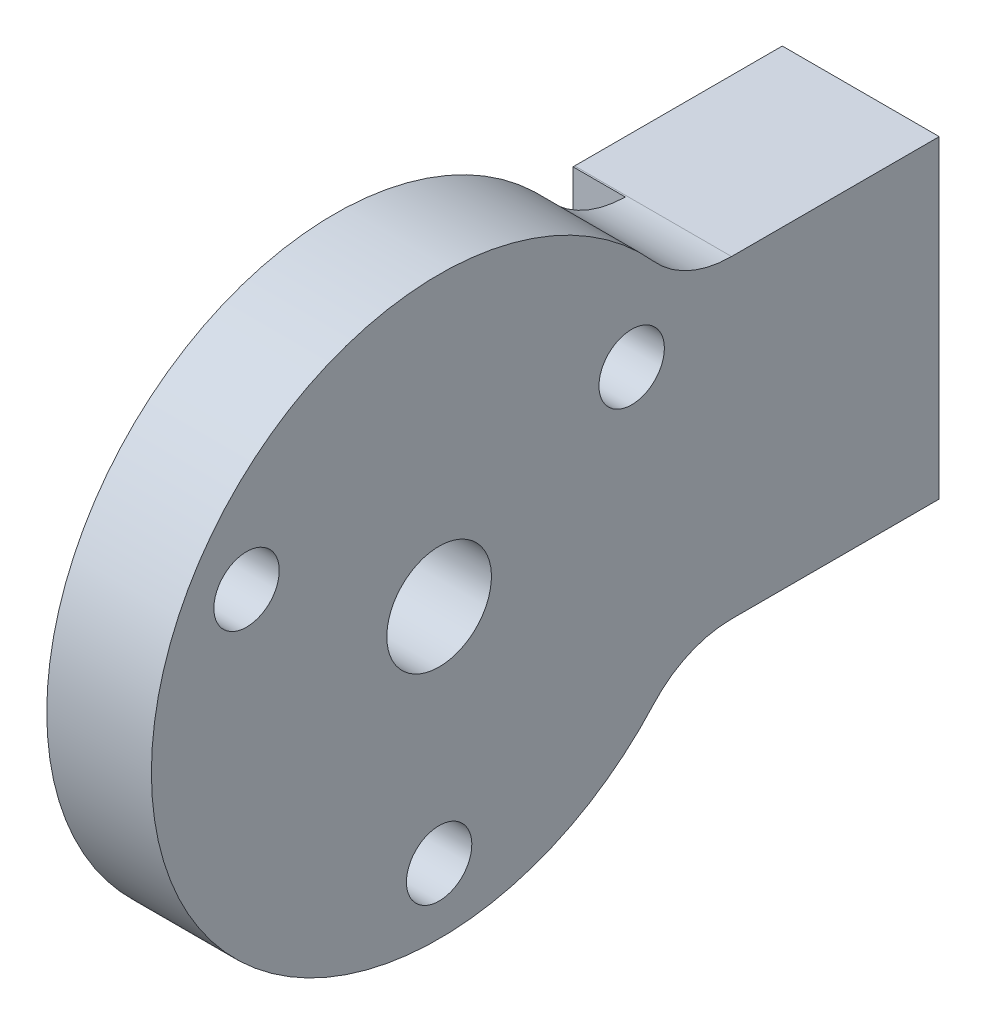
ISO-10303-21;
HEADER;
FILE_DESCRIPTION(('STEP AP214'),'2;1');
FILE_NAME('part.step','',(''),(''),'','','');
FILE_SCHEMA(('AUTOMOTIVE_DESIGN { 1 0 10303 214 1 1 1 1 }'));
ENDSEC;
DATA;
#1=APPLICATION_CONTEXT('core data for automotive mechanical design processes');
#2=APPLICATION_PROTOCOL_DEFINITION('international standard','automotive_design',2000,#1);
#3=PRODUCT_CONTEXT('',#1,'mechanical');
#4=PRODUCT('Part','Part','',(#3));
#5=PRODUCT_RELATED_PRODUCT_CATEGORY('part','',(#4));
#6=PRODUCT_DEFINITION_FORMATION('','',#4);
#7=PRODUCT_DEFINITION_CONTEXT('part definition',#1,'design');
#8=PRODUCT_DEFINITION('design','',#6,#7);
#9=PRODUCT_DEFINITION_SHAPE('','',#8);
#10=(LENGTH_UNIT() NAMED_UNIT(*) SI_UNIT(.MILLI.,.METRE.));
#11=(NAMED_UNIT(*) PLANE_ANGLE_UNIT() SI_UNIT($,.RADIAN.));
#12=(NAMED_UNIT(*) SI_UNIT($,.STERADIAN.) SOLID_ANGLE_UNIT());
#13=UNCERTAINTY_MEASURE_WITH_UNIT(LENGTH_MEASURE(1.E-05),#10,'distance_accuracy_value','');
#14=(GEOMETRIC_REPRESENTATION_CONTEXT(3) GLOBAL_UNCERTAINTY_ASSIGNED_CONTEXT((#13)) GLOBAL_UNIT_ASSIGNED_CONTEXT((#10,
#11,#12)) REPRESENTATION_CONTEXT('',''));
#15=CARTESIAN_POINT('',(0.,0.,0.));
#16=DIRECTION('',(0.,0.,1.));
#17=DIRECTION('',(1.,0.,0.));
#18=AXIS2_PLACEMENT_3D('',#15,#16,#17);
#19=CARTESIAN_POINT('',(-4.,-6.,8.));
#20=DIRECTION('',(0.,0.,1.));
#21=DIRECTION('',(1.,0.,0.));
#22=AXIS2_PLACEMENT_3D('',#19,#20,#21);
#23=PLANE('',#22);
#24=DIRECTION('',(0.,-1.,0.));
#25=VECTOR('',#24,1.);
#26=CARTESIAN_POINT('',(-4.,6.,8.));
#27=LINE('',#26,#25);
#28=CARTESIAN_POINT('',(-4.,6.00045513864682,8.));
#29=VERTEX_POINT('',#28);
#30=CARTESIAN_POINT('',(-4.,-6.00045513864682,8.));
#31=VERTEX_POINT('',#30);
#32=EDGE_CURVE('E57',#29,#31,#27,.T.);
#33=ORIENTED_EDGE('',*,*,#32,.T.);
#34=DIRECTION('',(1.,0.,0.));
#35=VECTOR('',#34,1.);
#36=CARTESIAN_POINT('',(-4.,-6.00045513864682,8.));
#37=LINE('',#36,#35);
#38=CARTESIAN_POINT('',(-2.,-6.00045513864682,8.));
#39=VERTEX_POINT('',#38);
#40=EDGE_CURVE('E44',#31,#39,#37,.T.);
#41=ORIENTED_EDGE('',*,*,#40,.T.);
#42=DIRECTION('',(0.,-1.,0.));
#43=VECTOR('',#42,1.);
#44=CARTESIAN_POINT('',(-2.,4.3,8.));
#45=LINE('',#44,#43);
#46=CARTESIAN_POINT('',(-2.,6.00045513864682,8.));
#47=VERTEX_POINT('',#46);
#48=EDGE_CURVE('E50',#47,#39,#45,.T.);
#49=ORIENTED_EDGE('',*,*,#48,.F.);
#50=DIRECTION('',(1.,0.,0.));
#51=VECTOR('',#50,1.);
#52=CARTESIAN_POINT('',(-2.,6.00045513864682,8.));
#53=LINE('',#52,#51);
#54=EDGE_CURVE('E196',#47,#29,#53,.F.);
#55=ORIENTED_EDGE('',*,*,#54,.T.);
#56=EDGE_LOOP('',(#33,#41,#49,#55));
#57=FACE_BOUND('',#56,.T.);
#58=ADVANCED_FACE('F36',(#57),#23,.T.);
#59=CARTESIAN_POINT('',(-4.,6.,8.));
#60=DIRECTION('',(1.,0.,0.));
#61=DIRECTION('',(0.,1.,0.));
#62=AXIS2_PLACEMENT_3D('',#59,#60,#61);
#63=PLANE('',#62);
#64=DIRECTION('',(0.,-1.,0.));
#65=VECTOR('',#64,1.);
#66=CARTESIAN_POINT('',(-4.,6.,0.));
#67=LINE('',#66,#65);
#68=CARTESIAN_POINT('',(-4.,6.,0.));
#69=VERTEX_POINT('',#68);
#70=CARTESIAN_POINT('',(-4.,-6.,0.));
#71=VERTEX_POINT('',#70);
#72=EDGE_CURVE('E161',#69,#71,#67,.T.);
#73=ORIENTED_EDGE('',*,*,#72,.T.);
#74=DIRECTION('',(0.,0.,-1.));
#75=VECTOR('',#74,1.);
#76=CARTESIAN_POINT('',(-4.,-6.,8.));
#77=LINE('',#76,#75);
#78=CARTESIAN_POINT('',(-4.,-6.,7.93966011250105));
#79=VERTEX_POINT('',#78);
#80=EDGE_CURVE('E180',#79,#71,#77,.T.);
#81=ORIENTED_EDGE('',*,*,#80,.F.);
#82=CARTESIAN_POINT('',(-4.,-10.,7.93966011250105));
#83=DIRECTION('',(1.,0.,0.));
#84=DIRECTION('',(0.,1.,0.));
#85=AXIS2_PLACEMENT_3D('',#82,#83,#84);
#86=CIRCLE('',#85,4.);
#87=EDGE_CURVE('E202',#79,#31,#86,.T.);
#88=ORIENTED_EDGE('',*,*,#87,.T.);
#89=ORIENTED_EDGE('',*,*,#32,.F.);
#90=CARTESIAN_POINT('',(-4.,10.,7.93966011250105));
#91=DIRECTION('',(1.,0.,0.));
#92=DIRECTION('',(0.,1.,0.));
#93=AXIS2_PLACEMENT_3D('',#90,#91,#92);
#94=CIRCLE('',#93,4.);
#95=CARTESIAN_POINT('',(-4.,6.,7.93966011250105));
#96=VERTEX_POINT('',#95);
#97=EDGE_CURVE('E198',#29,#96,#94,.T.);
#98=ORIENTED_EDGE('',*,*,#97,.T.);
#99=DIRECTION('',(0.,0.,-1.));
#100=VECTOR('',#99,1.);
#101=CARTESIAN_POINT('',(-4.,6.,8.));
#102=LINE('',#101,#100);
#103=EDGE_CURVE('E163',#96,#69,#102,.T.);
#104=ORIENTED_EDGE('',*,*,#103,.T.);
#105=EDGE_LOOP('',(#73,#81,#88,#89,#98,#104));
#106=FACE_BOUND('',#105,.T.);
#107=ADVANCED_FACE('F222',(#106),#63,.F.);
#108=CARTESIAN_POINT('',(-4.,-6.,8.));
#109=DIRECTION('',(0.,1.,0.));
#110=DIRECTION('',(0.,0.,1.));
#111=AXIS2_PLACEMENT_3D('',#108,#109,#110);
#112=PLANE('',#111);
#113=DIRECTION('',(0.,0.,-1.));
#114=VECTOR('',#113,1.);
#115=CARTESIAN_POINT('',(2.,-6.,8.));
#116=LINE('',#115,#114);
#117=CARTESIAN_POINT('',(2.,-6.,7.93966011250105));
#118=VERTEX_POINT('',#117);
#119=CARTESIAN_POINT('',(2.,-6.,0.));
#120=VERTEX_POINT('',#119);
#121=EDGE_CURVE('E178',#118,#120,#116,.T.);
#122=ORIENTED_EDGE('',*,*,#121,.F.);
#123=DIRECTION('',(1.,0.,0.));
#124=VECTOR('',#123,1.);
#125=CARTESIAN_POINT('',(-4.,-6.,7.93966011250105));
#126=LINE('',#125,#124);
#127=EDGE_CURVE('E190',#118,#79,#126,.F.);
#128=ORIENTED_EDGE('',*,*,#127,.T.);
#129=ORIENTED_EDGE('',*,*,#80,.T.);
#130=DIRECTION('',(1.,0.,0.));
#131=VECTOR('',#130,1.);
#132=CARTESIAN_POINT('',(-4.,-6.,0.));
#133=LINE('',#132,#131);
#134=EDGE_CURVE('E167',#71,#120,#133,.T.);
#135=ORIENTED_EDGE('',*,*,#134,.T.);
#136=EDGE_LOOP('',(#122,#128,#129,#135));
#137=FACE_BOUND('',#136,.T.);
#138=ADVANCED_FACE('F236',(#137),#112,.F.);
#139=CARTESIAN_POINT('',(2.,6.,8.));
#140=DIRECTION('',(-1.,0.,0.));
#141=DIRECTION('',(0.,-1.,0.));
#142=AXIS2_PLACEMENT_3D('',#139,#140,#141);
#143=PLANE('',#142);
#144=CARTESIAN_POINT('',(2.,0.,19.12));
#145=DIRECTION('',(-1.,0.,0.));
#146=DIRECTION('',(0.,-1.,0.));
#147=AXIS2_PLACEMENT_3D('',#144,#145,#146);
#148=CIRCLE('',#147,2.);
#149=CARTESIAN_POINT('',(2.,-2.,19.12));
#150=VERTEX_POINT('',#149);
#151=EDGE_CURVE('E121',#150,#150,#148,.F.);
#152=ORIENTED_EDGE('',*,*,#151,.F.);
#153=EDGE_LOOP('',(#152));
#154=FACE_BOUND('',#153,.T.);
#155=CARTESIAN_POINT('',(2.,4.24999999999993,11.7587840678322));
#156=DIRECTION('',(-1.,0.,0.));
#157=DIRECTION('',(0.,-1.,0.));
#158=AXIS2_PLACEMENT_3D('',#155,#156,#157);
#159=CIRCLE('',#158,1.25);
#160=CARTESIAN_POINT('',(2.,2.99999999999993,11.7587840678322));
#161=VERTEX_POINT('',#160);
#162=EDGE_CURVE('E127',#161,#161,#159,.F.);
#163=ORIENTED_EDGE('',*,*,#162,.F.);
#164=EDGE_LOOP('',(#163));
#165=FACE_BOUND('',#164,.T.);
#166=CARTESIAN_POINT('',(2.,4.25000000000004,26.4812159321677));
#167=DIRECTION('',(-1.,0.,0.));
#168=DIRECTION('',(0.,-1.,0.));
#169=AXIS2_PLACEMENT_3D('',#166,#167,#168);
#170=CIRCLE('',#169,1.25);
#171=CARTESIAN_POINT('',(2.,3.00000000000003,26.4812159321677));
#172=VERTEX_POINT('',#171);
#173=EDGE_CURVE('E133',#172,#172,#170,.F.);
#174=ORIENTED_EDGE('',*,*,#173,.F.);
#175=EDGE_LOOP('',(#174));
#176=FACE_BOUND('',#175,.T.);
#177=CARTESIAN_POINT('',(2.,-8.5,19.12));
#178=DIRECTION('',(-1.,0.,0.));
#179=DIRECTION('',(0.,-1.,0.));
#180=AXIS2_PLACEMENT_3D('',#177,#178,#179);
#181=CIRCLE('',#180,1.25);
#182=CARTESIAN_POINT('',(2.,-9.75,19.12));
#183=VERTEX_POINT('',#182);
#184=EDGE_CURVE('E139',#183,#183,#181,.F.);
#185=ORIENTED_EDGE('',*,*,#184,.F.);
#186=EDGE_LOOP('',(#185));
#187=FACE_BOUND('',#186,.T.);
#188=DIRECTION('',(0.,0.,-1.));
#189=VECTOR('',#188,1.);
#190=CARTESIAN_POINT('',(2.,6.,8.));
#191=LINE('',#190,#189);
#192=CARTESIAN_POINT('',(2.,6.,7.93966011250105));
#193=VERTEX_POINT('',#192);
#194=CARTESIAN_POINT('',(2.,6.,0.));
#195=VERTEX_POINT('',#194);
#196=EDGE_CURVE('E176',#193,#195,#191,.T.);
#197=ORIENTED_EDGE('',*,*,#196,.F.);
#198=CARTESIAN_POINT('',(2.,10.,7.93966011250105));
#199=DIRECTION('',(-1.,0.,0.));
#200=DIRECTION('',(0.,-1.,0.));
#201=AXIS2_PLACEMENT_3D('',#198,#199,#200);
#202=CIRCLE('',#201,4.);
#203=CARTESIAN_POINT('',(2.,7.33333333333333,10.9210840825008));
#204=VERTEX_POINT('',#203);
#205=EDGE_CURVE('E192',#193,#204,#202,.T.);
#206=ORIENTED_EDGE('',*,*,#205,.T.);
#207=CARTESIAN_POINT('',(2.,0.,19.12));
#208=DIRECTION('',(1.,0.,0.));
#209=DIRECTION('',(0.,1.,0.));
#210=AXIS2_PLACEMENT_3D('',#207,#208,#209);
#211=CIRCLE('',#210,11.);
#212=CARTESIAN_POINT('',(2.,-7.33333333333333,10.9210840825008));
#213=VERTEX_POINT('',#212);
#214=EDGE_CURVE('E146',#204,#213,#211,.T.);
#215=ORIENTED_EDGE('',*,*,#214,.T.);
#216=CARTESIAN_POINT('',(2.,-10.,7.93966011250105));
#217=DIRECTION('',(-1.,0.,0.));
#218=DIRECTION('',(0.,-1.,0.));
#219=AXIS2_PLACEMENT_3D('',#216,#217,#218);
#220=CIRCLE('',#219,4.);
#221=EDGE_CURVE('E200',#213,#118,#220,.T.);
#222=ORIENTED_EDGE('',*,*,#221,.T.);
#223=ORIENTED_EDGE('',*,*,#121,.T.);
#224=DIRECTION('',(0.,1.,0.));
#225=VECTOR('',#224,1.);
#226=CARTESIAN_POINT('',(2.,6.,0.));
#227=LINE('',#226,#225);
#228=EDGE_CURVE('E170',#120,#195,#227,.T.);
#229=ORIENTED_EDGE('',*,*,#228,.T.);
#230=EDGE_LOOP('',(#197,#206,#215,#222,#223,#229));
#231=FACE_BOUND('',#230,.T.);
#232=ADVANCED_FACE('F238',(#154,#165,#176,#187,#231),#143,.F.);
#233=CARTESIAN_POINT('',(-4.,6.,8.));
#234=DIRECTION('',(0.,-1.,0.));
#235=DIRECTION('',(0.,0.,-1.));
#236=AXIS2_PLACEMENT_3D('',#233,#234,#235);
#237=PLANE('',#236);
#238=ORIENTED_EDGE('',*,*,#103,.F.);
#239=DIRECTION('',(1.,0.,0.));
#240=VECTOR('',#239,1.);
#241=CARTESIAN_POINT('',(-4.,6.,7.93966011250105));
#242=LINE('',#241,#240);
#243=EDGE_CURVE('E182',#96,#193,#242,.T.);
#244=ORIENTED_EDGE('',*,*,#243,.T.);
#245=ORIENTED_EDGE('',*,*,#196,.T.);
#246=DIRECTION('',(-1.,0.,0.));
#247=VECTOR('',#246,1.);
#248=CARTESIAN_POINT('',(-4.,6.,0.));
#249=LINE('',#248,#247);
#250=EDGE_CURVE('E164',#195,#69,#249,.T.);
#251=ORIENTED_EDGE('',*,*,#250,.T.);
#252=EDGE_LOOP('',(#238,#244,#245,#251));
#253=FACE_BOUND('',#252,.T.);
#254=ADVANCED_FACE('F224',(#253),#237,.F.);
#255=CARTESIAN_POINT('',(-4.,-6.,0.));
#256=DIRECTION('',(0.,0.,1.));
#257=DIRECTION('',(1.,0.,0.));
#258=AXIS2_PLACEMENT_3D('',#255,#256,#257);
#259=PLANE('',#258);
#260=CARTESIAN_POINT('',(-1.,-3.,0.));
#261=DIRECTION('',(0.,0.,-1.));
#262=DIRECTION('',(-1.,0.,0.));
#263=AXIS2_PLACEMENT_3D('',#260,#261,#262);
#264=CIRCLE('',#263,1.25);
#265=CARTESIAN_POINT('',(-2.25,-3.,0.));
#266=VERTEX_POINT('',#265);
#267=EDGE_CURVE('E152',#266,#266,#264,.T.);
#268=ORIENTED_EDGE('',*,*,#267,.F.);
#269=EDGE_LOOP('',(#268));
#270=FACE_BOUND('',#269,.T.);
#271=CARTESIAN_POINT('',(-1.,3.,0.));
#272=DIRECTION('',(0.,0.,-1.));
#273=DIRECTION('',(-1.,0.,0.));
#274=AXIS2_PLACEMENT_3D('',#271,#272,#273);
#275=CIRCLE('',#274,1.25);
#276=CARTESIAN_POINT('',(-2.25,3.,0.));
#277=VERTEX_POINT('',#276);
#278=EDGE_CURVE('E157',#277,#277,#275,.T.);
#279=ORIENTED_EDGE('',*,*,#278,.F.);
#280=EDGE_LOOP('',(#279));
#281=FACE_BOUND('',#280,.T.);
#282=ORIENTED_EDGE('',*,*,#72,.F.);
#283=ORIENTED_EDGE('',*,*,#250,.F.);
#284=ORIENTED_EDGE('',*,*,#228,.F.);
#285=ORIENTED_EDGE('',*,*,#134,.F.);
#286=EDGE_LOOP('',(#282,#283,#284,#285));
#287=FACE_BOUND('',#286,.T.);
#288=ADVANCED_FACE('F231',(#270,#281,#287),#259,.F.);
#289=CARTESIAN_POINT('',(-2.,4.3,9.));
#290=DIRECTION('',(1.,0.,0.));
#291=DIRECTION('',(0.,1.,0.));
#292=AXIS2_PLACEMENT_3D('',#289,#290,#291);
#293=PLANE('',#292);
#294=CARTESIAN_POINT('',(-2.,4.24999999999993,11.7587840678322));
#295=DIRECTION('',(-1.,0.,0.));
#296=DIRECTION('',(0.,0.499999999999992,-0.866025403784443));
#297=AXIS2_PLACEMENT_3D('',#294,#295,#296);
#298=CIRCLE('',#297,1.25);
#299=CARTESIAN_POINT('',(-2.,4.87499999999992,10.6762523131017));
#300=VERTEX_POINT('',#299);
#301=EDGE_CURVE('E124',#300,#300,#298,.T.);
#302=ORIENTED_EDGE('',*,*,#301,.F.);
#303=EDGE_LOOP('',(#302));
#304=FACE_BOUND('',#303,.T.);
#305=CARTESIAN_POINT('',(-2.,4.25000000000003,26.4812159321677));
#306=DIRECTION('',(-1.,0.,0.));
#307=DIRECTION('',(0.,0.500000000000004,0.866025403784436));
#308=AXIS2_PLACEMENT_3D('',#305,#306,#307);
#309=CIRCLE('',#308,1.25);
#310=CARTESIAN_POINT('',(-2.,4.87500000000004,27.5637476868983));
#311=VERTEX_POINT('',#310);
#312=EDGE_CURVE('E130',#311,#311,#309,.T.);
#313=ORIENTED_EDGE('',*,*,#312,.F.);
#314=EDGE_LOOP('',(#313));
#315=FACE_BOUND('',#314,.T.);
#316=CARTESIAN_POINT('',(-2.,-8.5,19.12));
#317=DIRECTION('',(-1.,0.,0.));
#318=DIRECTION('',(0.,-1.,0.));
#319=AXIS2_PLACEMENT_3D('',#316,#317,#318);
#320=CIRCLE('',#319,1.25);
#321=CARTESIAN_POINT('',(-2.,-9.75,19.12));
#322=VERTEX_POINT('',#321);
#323=EDGE_CURVE('E136',#322,#322,#320,.T.);
#324=ORIENTED_EDGE('',*,*,#323,.F.);
#325=EDGE_LOOP('',(#324));
#326=FACE_BOUND('',#325,.T.);
#327=CARTESIAN_POINT('',(-2.,0.,19.12));
#328=DIRECTION('',(-1.,0.,0.));
#329=DIRECTION('',(0.,-1.,0.));
#330=AXIS2_PLACEMENT_3D('',#327,#328,#329);
#331=CIRCLE('',#330,5.25);
#332=CARTESIAN_POINT('',(-2.,-5.25,19.12));
#333=VERTEX_POINT('',#332);
#334=EDGE_CURVE('E142',#333,#333,#331,.T.);
#335=ORIENTED_EDGE('',*,*,#334,.F.);
#336=EDGE_LOOP('',(#335));
#337=FACE_BOUND('',#336,.T.);
#338=ORIENTED_EDGE('',*,*,#48,.T.);
#339=CARTESIAN_POINT('',(-2.,-10.,7.93966011250105));
#340=DIRECTION('',(1.,0.,0.));
#341=DIRECTION('',(0.,1.,0.));
#342=AXIS2_PLACEMENT_3D('',#339,#340,#341);
#343=CIRCLE('',#342,4.);
#344=CARTESIAN_POINT('',(-2.,-7.33333333333333,10.9210840825008));
#345=VERTEX_POINT('',#344);
#346=EDGE_CURVE('E11',#39,#345,#343,.T.);
#347=ORIENTED_EDGE('',*,*,#346,.T.);
#348=CARTESIAN_POINT('',(-2.,0.,19.12));
#349=DIRECTION('',(1.,0.,0.));
#350=DIRECTION('',(0.,1.,0.));
#351=AXIS2_PLACEMENT_3D('',#348,#349,#350);
#352=CIRCLE('',#351,11.);
#353=CARTESIAN_POINT('',(-2.,7.33333333333333,10.9210840825008));
#354=VERTEX_POINT('',#353);
#355=EDGE_CURVE('E149',#354,#345,#352,.T.);
#356=ORIENTED_EDGE('',*,*,#355,.F.);
#357=CARTESIAN_POINT('',(-2.,10.,7.93966011250105));
#358=DIRECTION('',(1.,0.,0.));
#359=DIRECTION('',(0.,1.,0.));
#360=AXIS2_PLACEMENT_3D('',#357,#358,#359);
#361=CIRCLE('',#360,4.);
#362=EDGE_CURVE('E194',#354,#47,#361,.T.);
#363=ORIENTED_EDGE('',*,*,#362,.T.);
#364=EDGE_LOOP('',(#338,#347,#356,#363));
#365=FACE_BOUND('',#364,.T.);
#366=ADVANCED_FACE('F209',(#304,#315,#326,#337,#365),#293,.F.);
#367=CARTESIAN_POINT('',(-1.,3.,6.));
#368=DIRECTION('',(0.,0.,-1.));
#369=DIRECTION('',(-1.,0.,0.));
#370=AXIS2_PLACEMENT_3D('',#367,#368,#369);
#371=CYLINDRICAL_SURFACE('',#370,1.25);
#372=CARTESIAN_POINT('',(-1.,3.,6.));
#373=DIRECTION('',(0.,0.,-1.));
#374=DIRECTION('',(-1.,0.,0.));
#375=AXIS2_PLACEMENT_3D('',#372,#373,#374);
#376=CIRCLE('',#375,1.25);
#377=CARTESIAN_POINT('',(-2.25,3.,6.));
#378=VERTEX_POINT('',#377);
#379=EDGE_CURVE('E111',#378,#378,#376,.T.);
#380=ORIENTED_EDGE('',*,*,#379,.F.);
#381=EDGE_LOOP('',(#380));
#382=FACE_BOUND('',#381,.T.);
#383=ORIENTED_EDGE('',*,*,#278,.T.);
#384=EDGE_LOOP('',(#383));
#385=FACE_BOUND('',#384,.T.);
#386=ADVANCED_FACE('F264',(#382,#385),#371,.F.);
#387=CARTESIAN_POINT('',(-1.,-3.,6.));
#388=DIRECTION('',(0.,0.,-1.));
#389=DIRECTION('',(-1.,0.,0.));
#390=AXIS2_PLACEMENT_3D('',#387,#388,#389);
#391=CYLINDRICAL_SURFACE('',#390,1.25);
#392=CARTESIAN_POINT('',(-1.,-3.,6.));
#393=DIRECTION('',(0.,0.,-1.));
#394=DIRECTION('',(-1.,0.,0.));
#395=AXIS2_PLACEMENT_3D('',#392,#393,#394);
#396=CIRCLE('',#395,1.25);
#397=CARTESIAN_POINT('',(-2.25,-3.,6.));
#398=VERTEX_POINT('',#397);
#399=EDGE_CURVE('E113',#398,#398,#396,.T.);
#400=ORIENTED_EDGE('',*,*,#399,.F.);
#401=EDGE_LOOP('',(#400));
#402=FACE_BOUND('',#401,.T.);
#403=ORIENTED_EDGE('',*,*,#267,.T.);
#404=EDGE_LOOP('',(#403));
#405=FACE_BOUND('',#404,.T.);
#406=ADVANCED_FACE('F271',(#402,#405),#391,.F.);
#407=CARTESIAN_POINT('',(-2.,0.,19.12));
#408=DIRECTION('',(1.,0.,0.));
#409=DIRECTION('',(0.,1.,0.));
#410=AXIS2_PLACEMENT_3D('',#407,#408,#409);
#411=CYLINDRICAL_SURFACE('',#410,11.);
#412=ORIENTED_EDGE('',*,*,#214,.F.);
#413=DIRECTION('',(1.,0.,0.));
#414=VECTOR('',#413,1.);
#415=CARTESIAN_POINT('',(-2.,7.33333333333333,10.9210840825008));
#416=LINE('',#415,#414);
#417=EDGE_CURVE('E188',#204,#354,#416,.F.);
#418=ORIENTED_EDGE('',*,*,#417,.T.);
#419=ORIENTED_EDGE('',*,*,#355,.T.);
#420=DIRECTION('',(1.,0.,0.));
#421=VECTOR('',#420,1.);
#422=CARTESIAN_POINT('',(-2.,-7.33333333333333,10.9210840825008));
#423=LINE('',#422,#421);
#424=EDGE_CURVE('E185',#345,#213,#423,.T.);
#425=ORIENTED_EDGE('',*,*,#424,.T.);
#426=EDGE_LOOP('',(#412,#418,#419,#425));
#427=FACE_BOUND('',#426,.T.);
#428=ADVANCED_FACE('F213',(#427),#411,.T.);
#429=CARTESIAN_POINT('',(-1.,0.,19.12));
#430=DIRECTION('',(-1.,0.,0.));
#431=DIRECTION('',(0.,-1.,0.));
#432=AXIS2_PLACEMENT_3D('',#429,#430,#431);
#433=CYLINDRICAL_SURFACE('',#432,5.25);
#434=CARTESIAN_POINT('',(-1.,0.,19.12));
#435=DIRECTION('',(-1.,0.,0.));
#436=DIRECTION('',(0.,-1.,0.));
#437=AXIS2_PLACEMENT_3D('',#434,#435,#436);
#438=CIRCLE('',#437,5.25);
#439=CARTESIAN_POINT('',(-1.,-5.25,19.12));
#440=VERTEX_POINT('',#439);
#441=EDGE_CURVE('E143',#440,#440,#438,.T.);
#442=ORIENTED_EDGE('',*,*,#441,.F.);
#443=EDGE_LOOP('',(#442));
#444=FACE_BOUND('',#443,.T.);
#445=ORIENTED_EDGE('',*,*,#334,.T.);
#446=EDGE_LOOP('',(#445));
#447=FACE_BOUND('',#446,.T.);
#448=ADVANCED_FACE('F280',(#444,#447),#433,.F.);
#449=CARTESIAN_POINT('',(-1.,0.,19.12));
#450=DIRECTION('',(-1.,0.,0.));
#451=DIRECTION('',(0.,-1.,0.));
#452=AXIS2_PLACEMENT_3D('',#449,#450,#451);
#453=PLANE('',#452);
#454=CARTESIAN_POINT('',(-1.,0.,19.12));
#455=DIRECTION('',(-1.,0.,0.));
#456=DIRECTION('',(0.,-1.,0.));
#457=AXIS2_PLACEMENT_3D('',#454,#455,#456);
#458=CIRCLE('',#457,2.);
#459=CARTESIAN_POINT('',(-1.,-2.,19.12));
#460=VERTEX_POINT('',#459);
#461=EDGE_CURVE('E116',#460,#460,#458,.T.);
#462=ORIENTED_EDGE('',*,*,#461,.F.);
#463=EDGE_LOOP('',(#462));
#464=FACE_BOUND('',#463,.T.);
#465=ORIENTED_EDGE('',*,*,#441,.T.);
#466=EDGE_LOOP('',(#465));
#467=FACE_BOUND('',#466,.T.);
#468=ADVANCED_FACE('F283',(#464,#467),#453,.T.);
#469=CARTESIAN_POINT('',(5.53553390593274,-8.5,19.12));
#470=DIRECTION('',(-1.,0.,0.));
#471=DIRECTION('',(0.,-1.,0.));
#472=AXIS2_PLACEMENT_3D('',#469,#470,#471);
#473=CYLINDRICAL_SURFACE('',#472,1.25);
#474=ORIENTED_EDGE('',*,*,#184,.T.);
#475=EDGE_LOOP('',(#474));
#476=FACE_BOUND('',#475,.T.);
#477=ORIENTED_EDGE('',*,*,#323,.T.);
#478=EDGE_LOOP('',(#477));
#479=FACE_BOUND('',#478,.T.);
#480=ADVANCED_FACE('F287',(#476,#479),#473,.F.);
#481=CARTESIAN_POINT('',(5.53553390593274,4.25000000000004,26.4812159321677));
#482=DIRECTION('',(-1.,0.,0.));
#483=DIRECTION('',(0.,-1.,0.));
#484=AXIS2_PLACEMENT_3D('',#481,#482,#483);
#485=CYLINDRICAL_SURFACE('',#484,1.25);
#486=ORIENTED_EDGE('',*,*,#173,.T.);
#487=EDGE_LOOP('',(#486));
#488=FACE_BOUND('',#487,.T.);
#489=ORIENTED_EDGE('',*,*,#312,.T.);
#490=EDGE_LOOP('',(#489));
#491=FACE_BOUND('',#490,.T.);
#492=ADVANCED_FACE('F291',(#488,#491),#485,.F.);
#493=CARTESIAN_POINT('',(5.53553390593274,4.24999999999993,11.7587840678322));
#494=DIRECTION('',(-1.,0.,0.));
#495=DIRECTION('',(0.,-1.,0.));
#496=AXIS2_PLACEMENT_3D('',#493,#494,#495);
#497=CYLINDRICAL_SURFACE('',#496,1.25);
#498=ORIENTED_EDGE('',*,*,#162,.T.);
#499=EDGE_LOOP('',(#498));
#500=FACE_BOUND('',#499,.T.);
#501=ORIENTED_EDGE('',*,*,#301,.T.);
#502=EDGE_LOOP('',(#501));
#503=FACE_BOUND('',#502,.T.);
#504=ADVANCED_FACE('F295',(#500,#503),#497,.F.);
#505=CARTESIAN_POINT('',(7.65685424949239,0.,19.12));
#506=DIRECTION('',(-1.,0.,0.));
#507=DIRECTION('',(0.,-1.,0.));
#508=AXIS2_PLACEMENT_3D('',#505,#506,#507);
#509=CYLINDRICAL_SURFACE('',#508,2.);
#510=ORIENTED_EDGE('',*,*,#151,.T.);
#511=EDGE_LOOP('',(#510));
#512=FACE_BOUND('',#511,.T.);
#513=ORIENTED_EDGE('',*,*,#461,.T.);
#514=EDGE_LOOP('',(#513));
#515=FACE_BOUND('',#514,.T.);
#516=ADVANCED_FACE('F299',(#512,#515),#509,.F.);
#517=CARTESIAN_POINT('',(-2.,10.,7.93966011250105));
#518=DIRECTION('',(1.,0.,0.));
#519=DIRECTION('',(0.,1.,0.));
#520=AXIS2_PLACEMENT_3D('',#517,#518,#519);
#521=CYLINDRICAL_SURFACE('',#520,4.);
#522=ORIENTED_EDGE('',*,*,#362,.F.);
#523=ORIENTED_EDGE('',*,*,#417,.F.);
#524=ORIENTED_EDGE('',*,*,#205,.F.);
#525=ORIENTED_EDGE('',*,*,#243,.F.);
#526=ORIENTED_EDGE('',*,*,#97,.F.);
#527=ORIENTED_EDGE('',*,*,#54,.F.);
#528=EDGE_LOOP('',(#522,#523,#524,#525,#526,#527));
#529=FACE_BOUND('',#528,.T.);
#530=ADVANCED_FACE('F216',(#529),#521,.F.);
#531=CARTESIAN_POINT('',(-2.,-10.,7.93966011250105));
#532=DIRECTION('',(1.,0.,0.));
#533=DIRECTION('',(0.,1.,0.));
#534=AXIS2_PLACEMENT_3D('',#531,#532,#533);
#535=CYLINDRICAL_SURFACE('',#534,4.);
#536=ORIENTED_EDGE('',*,*,#87,.F.);
#537=ORIENTED_EDGE('',*,*,#127,.F.);
#538=ORIENTED_EDGE('',*,*,#221,.F.);
#539=ORIENTED_EDGE('',*,*,#424,.F.);
#540=ORIENTED_EDGE('',*,*,#346,.F.);
#541=ORIENTED_EDGE('',*,*,#40,.F.);
#542=EDGE_LOOP('',(#536,#537,#538,#539,#540,#541));
#543=FACE_BOUND('',#542,.T.);
#544=ADVANCED_FACE('F38',(#543),#535,.F.);
#545=CARTESIAN_POINT('',(-1.,-3.,6.));
#546=DIRECTION('',(0.,0.,-1.));
#547=DIRECTION('',(-1.,0.,0.));
#548=AXIS2_PLACEMENT_3D('',#545,#546,#547);
#549=CONICAL_SURFACE('',#548,1.25,1.02974425867665);
#550=CARTESIAN_POINT('',(-1.,-3.,6.75107577378445));
#551=VERTEX_POINT('',#550);
#552=VERTEX_LOOP('',#551);
#553=FACE_BOUND('',#552,.T.);
#554=ORIENTED_EDGE('',*,*,#399,.T.);
#555=EDGE_LOOP('',(#554));
#556=FACE_BOUND('',#555,.T.);
#557=ADVANCED_FACE('F107',(#553,#556),#549,.F.);
#558=CARTESIAN_POINT('',(-1.,3.,6.));
#559=DIRECTION('',(0.,0.,-1.));
#560=DIRECTION('',(-1.,0.,0.));
#561=AXIS2_PLACEMENT_3D('',#558,#559,#560);
#562=CONICAL_SURFACE('',#561,1.25,1.02974425867665);
#563=CARTESIAN_POINT('',(-1.,3.,6.75107577378445));
#564=VERTEX_POINT('',#563);
#565=VERTEX_LOOP('',#564);
#566=FACE_BOUND('',#565,.T.);
#567=ORIENTED_EDGE('',*,*,#379,.T.);
#568=EDGE_LOOP('',(#567));
#569=FACE_BOUND('',#568,.T.);
#570=ADVANCED_FACE('F104',(#566,#569),#562,.F.);
#571=CLOSED_SHELL('',(#58,#107,#138,#232,#254,#288,#366,#386,#406,#428,#448,#468,#480,#492,#504,
#516,#530,#544,#557,#570));
#572=MANIFOLD_SOLID_BREP('B2',#571);
#573=ADVANCED_BREP_SHAPE_REPRESENTATION('',(#18,#572),#14);
#574=SHAPE_DEFINITION_REPRESENTATION(#9,#573);
ENDSEC;
END-ISO-10303-21;
